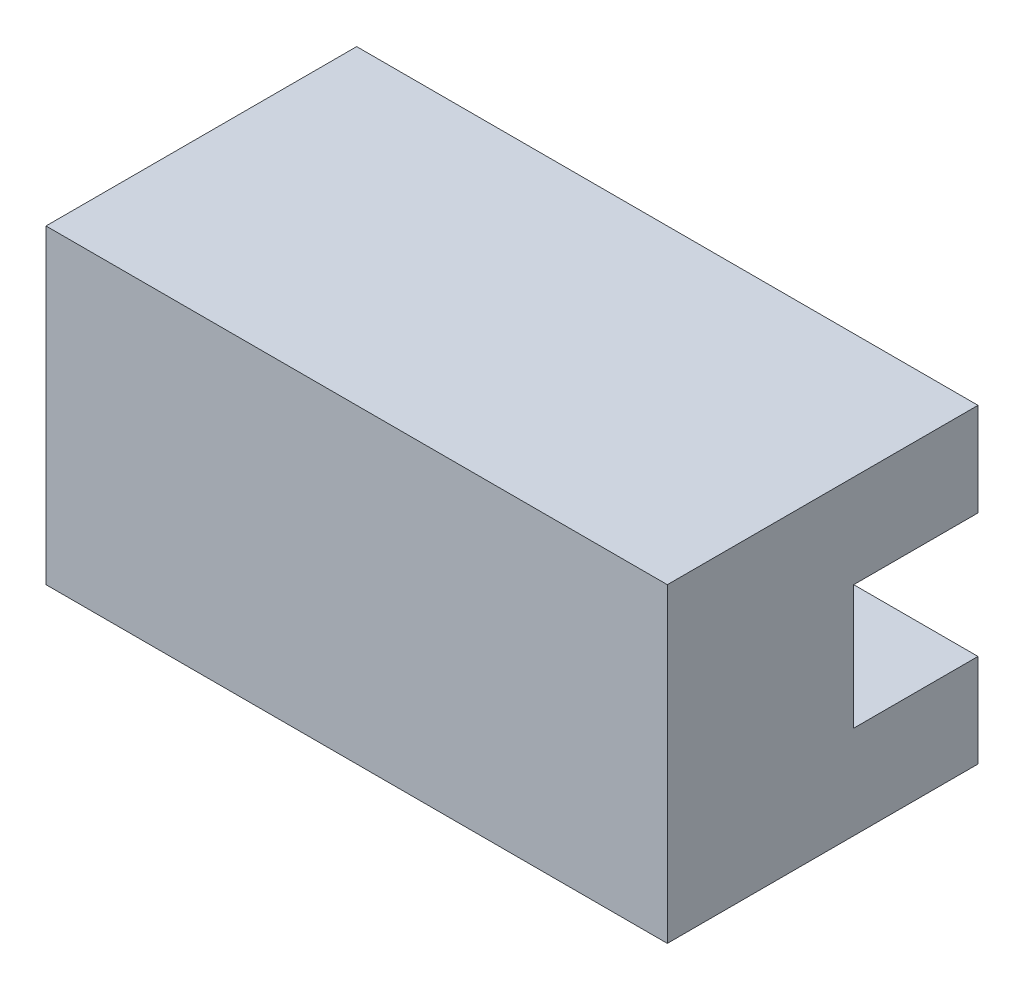
ISO-10303-21;
HEADER;
FILE_DESCRIPTION(('STEP AP214'),'2;1');
FILE_NAME('part.step','',(''),(''),'','','');
FILE_SCHEMA(('AUTOMOTIVE_DESIGN { 1 0 10303 214 1 1 1 1 }'));
ENDSEC;
DATA;
#1=APPLICATION_CONTEXT('core data for automotive mechanical design processes');
#2=APPLICATION_PROTOCOL_DEFINITION('international standard','automotive_design',2000,#1);
#3=PRODUCT_CONTEXT('',#1,'mechanical');
#4=PRODUCT('Part','Part','',(#3));
#5=PRODUCT_RELATED_PRODUCT_CATEGORY('part','',(#4));
#6=PRODUCT_DEFINITION_FORMATION('','',#4);
#7=PRODUCT_DEFINITION_CONTEXT('part definition',#1,'design');
#8=PRODUCT_DEFINITION('design','',#6,#7);
#9=PRODUCT_DEFINITION_SHAPE('','',#8);
#10=(LENGTH_UNIT() NAMED_UNIT(*) SI_UNIT(.MILLI.,.METRE.));
#11=(NAMED_UNIT(*) PLANE_ANGLE_UNIT() SI_UNIT($,.RADIAN.));
#12=(NAMED_UNIT(*) SI_UNIT($,.STERADIAN.) SOLID_ANGLE_UNIT());
#13=UNCERTAINTY_MEASURE_WITH_UNIT(LENGTH_MEASURE(1.E-05),#10,'distance_accuracy_value','');
#14=(GEOMETRIC_REPRESENTATION_CONTEXT(3) GLOBAL_UNCERTAINTY_ASSIGNED_CONTEXT((#13)) GLOBAL_UNIT_ASSIGNED_CONTEXT((#10,
#11,#12)) REPRESENTATION_CONTEXT('',''));
#15=CARTESIAN_POINT('',(0.,0.,0.));
#16=DIRECTION('',(0.,0.,1.));
#17=DIRECTION('',(1.,0.,0.));
#18=AXIS2_PLACEMENT_3D('',#15,#16,#17);
#19=CARTESIAN_POINT('',(-100.,100.,-50.));
#20=DIRECTION('',(0.,0.,1.));
#21=DIRECTION('',(1.,0.,0.));
#22=AXIS2_PLACEMENT_3D('',#19,#20,#21);
#23=PLANE('',#22);
#24=DIRECTION('',(0.,-1.,0.));
#25=VECTOR('',#24,1.);
#26=CARTESIAN_POINT('',(-100.,100.,-50.));
#27=LINE('',#26,#25);
#28=CARTESIAN_POINT('',(-100.,30.,-50.));
#29=VERTEX_POINT('',#28);
#30=CARTESIAN_POINT('',(-100.,0.,-50.));
#31=VERTEX_POINT('',#30);
#32=EDGE_CURVE('E130',#29,#31,#27,.T.);
#33=ORIENTED_EDGE('',*,*,#32,.F.);
#34=DIRECTION('',(1.,0.,0.));
#35=VECTOR('',#34,1.);
#36=CARTESIAN_POINT('',(-100.,30.,-50.));
#37=LINE('',#36,#35);
#38=CARTESIAN_POINT('',(100.,30.,-50.));
#39=VERTEX_POINT('',#38);
#40=EDGE_CURVE('E146',#29,#39,#37,.T.);
#41=ORIENTED_EDGE('',*,*,#40,.T.);
#42=DIRECTION('',(0.,-1.,0.));
#43=VECTOR('',#42,1.);
#44=CARTESIAN_POINT('',(100.,100.,-50.));
#45=LINE('',#44,#43);
#46=CARTESIAN_POINT('',(100.,0.,-50.));
#47=VERTEX_POINT('',#46);
#48=EDGE_CURVE('E45',#39,#47,#45,.T.);
#49=ORIENTED_EDGE('',*,*,#48,.T.);
#50=DIRECTION('',(-1.,0.,0.));
#51=VECTOR('',#50,1.);
#52=CARTESIAN_POINT('',(-100.,0.,-50.));
#53=LINE('',#52,#51);
#54=EDGE_CURVE('E140',#47,#31,#53,.T.);
#55=ORIENTED_EDGE('',*,*,#54,.T.);
#56=EDGE_LOOP('',(#33,#41,#49,#55));
#57=FACE_BOUND('',#56,.T.);
#58=ADVANCED_FACE('F37',(#57),#23,.F.);
#59=CARTESIAN_POINT('',(100.,100.,50.));
#60=DIRECTION('',(-1.,0.,0.));
#61=DIRECTION('',(0.,0.,1.));
#62=AXIS2_PLACEMENT_3D('',#59,#60,#61);
#63=PLANE('',#62);
#64=ORIENTED_EDGE('',*,*,#48,.F.);
#65=DIRECTION('',(0.,0.,-1.));
#66=VECTOR('',#65,1.);
#67=CARTESIAN_POINT('',(100.,30.,-50.));
#68=LINE('',#67,#66);
#69=CARTESIAN_POINT('',(100.,30.,-10.));
#70=VERTEX_POINT('',#69);
#71=EDGE_CURVE('E119',#70,#39,#68,.T.);
#72=ORIENTED_EDGE('',*,*,#71,.F.);
#73=DIRECTION('',(0.,-1.,0.));
#74=VECTOR('',#73,1.);
#75=CARTESIAN_POINT('',(100.,70.,-10.));
#76=LINE('',#75,#74);
#77=CARTESIAN_POINT('',(100.,70.,-10.));
#78=VERTEX_POINT('',#77);
#79=EDGE_CURVE('E157',#78,#70,#76,.T.);
#80=ORIENTED_EDGE('',*,*,#79,.F.);
#81=DIRECTION('',(0.,0.,1.));
#82=VECTOR('',#81,1.);
#83=CARTESIAN_POINT('',(100.,70.,-50.));
#84=LINE('',#83,#82);
#85=CARTESIAN_POINT('',(100.,70.,-50.));
#86=VERTEX_POINT('',#85);
#87=EDGE_CURVE('E160',#86,#78,#84,.T.);
#88=ORIENTED_EDGE('',*,*,#87,.F.);
#89=CARTESIAN_POINT('',(100.,100.,-50.));
#90=VERTEX_POINT('',#89);
#91=EDGE_CURVE('E11',#90,#86,#45,.T.);
#92=ORIENTED_EDGE('',*,*,#91,.F.);
#93=DIRECTION('',(0.,0.,-1.));
#94=VECTOR('',#93,1.);
#95=CARTESIAN_POINT('',(100.,100.,50.));
#96=LINE('',#95,#94);
#97=CARTESIAN_POINT('',(100.,100.,50.));
#98=VERTEX_POINT('',#97);
#99=EDGE_CURVE('E137',#98,#90,#96,.T.);
#100=ORIENTED_EDGE('',*,*,#99,.F.);
#101=DIRECTION('',(0.,-1.,0.));
#102=VECTOR('',#101,1.);
#103=CARTESIAN_POINT('',(100.,100.,50.));
#104=LINE('',#103,#102);
#105=CARTESIAN_POINT('',(100.,0.,50.));
#106=VERTEX_POINT('',#105);
#107=EDGE_CURVE('E134',#98,#106,#104,.T.);
#108=ORIENTED_EDGE('',*,*,#107,.T.);
#109=DIRECTION('',(0.,0.,-1.));
#110=VECTOR('',#109,1.);
#111=CARTESIAN_POINT('',(100.,0.,50.));
#112=LINE('',#111,#110);
#113=EDGE_CURVE('E143',#106,#47,#112,.T.);
#114=ORIENTED_EDGE('',*,*,#113,.T.);
#115=EDGE_LOOP('',(#64,#72,#80,#88,#92,#100,#108,#114));
#116=FACE_BOUND('',#115,.T.);
#117=ADVANCED_FACE('F39',(#116),#63,.F.);
#118=ORIENTED_EDGE('',*,*,#91,.T.);
#119=DIRECTION('',(1.,0.,0.));
#120=VECTOR('',#119,1.);
#121=CARTESIAN_POINT('',(-100.,70.,-50.));
#122=LINE('',#121,#120);
#123=CARTESIAN_POINT('',(-100.,70.,-50.));
#124=VERTEX_POINT('',#123);
#125=EDGE_CURVE('E114',#124,#86,#122,.T.);
#126=ORIENTED_EDGE('',*,*,#125,.F.);
#127=CARTESIAN_POINT('',(-100.,100.,-50.));
#128=VERTEX_POINT('',#127);
#129=EDGE_CURVE('E122',#128,#124,#27,.T.);
#130=ORIENTED_EDGE('',*,*,#129,.F.);
#131=DIRECTION('',(-1.,0.,0.));
#132=VECTOR('',#131,1.);
#133=CARTESIAN_POINT('',(-100.,100.,-50.));
#134=LINE('',#133,#132);
#135=EDGE_CURVE('E89',#90,#128,#134,.T.);
#136=ORIENTED_EDGE('',*,*,#135,.F.);
#137=EDGE_LOOP('',(#118,#126,#130,#136));
#138=FACE_BOUND('',#137,.T.);
#139=ADVANCED_FACE('F121',(#138),#23,.F.);
#140=CARTESIAN_POINT('',(-100.,100.,50.));
#141=DIRECTION('',(1.,0.,0.));
#142=DIRECTION('',(0.,0.,-1.));
#143=AXIS2_PLACEMENT_3D('',#140,#141,#142);
#144=PLANE('',#143);
#145=DIRECTION('',(0.,-1.,0.));
#146=VECTOR('',#145,1.);
#147=CARTESIAN_POINT('',(-100.,70.,-10.));
#148=LINE('',#147,#146);
#149=CARTESIAN_POINT('',(-100.,70.,-10.));
#150=VERTEX_POINT('',#149);
#151=CARTESIAN_POINT('',(-100.,30.,-10.));
#152=VERTEX_POINT('',#151);
#153=EDGE_CURVE('E52',#150,#152,#148,.T.);
#154=ORIENTED_EDGE('',*,*,#153,.T.);
#155=DIRECTION('',(0.,0.,-1.));
#156=VECTOR('',#155,1.);
#157=CARTESIAN_POINT('',(-100.,30.,-50.));
#158=LINE('',#157,#156);
#159=EDGE_CURVE('E125',#152,#29,#158,.T.);
#160=ORIENTED_EDGE('',*,*,#159,.T.);
#161=ORIENTED_EDGE('',*,*,#32,.T.);
#162=DIRECTION('',(0.,0.,1.));
#163=VECTOR('',#162,1.);
#164=CARTESIAN_POINT('',(-100.,0.,50.));
#165=LINE('',#164,#163);
#166=CARTESIAN_POINT('',(-100.,0.,50.));
#167=VERTEX_POINT('',#166);
#168=EDGE_CURVE('E138',#31,#167,#165,.T.);
#169=ORIENTED_EDGE('',*,*,#168,.T.);
#170=DIRECTION('',(0.,-1.,0.));
#171=VECTOR('',#170,1.);
#172=CARTESIAN_POINT('',(-100.,100.,50.));
#173=LINE('',#172,#171);
#174=CARTESIAN_POINT('',(-100.,100.,50.));
#175=VERTEX_POINT('',#174);
#176=EDGE_CURVE('E131',#175,#167,#173,.T.);
#177=ORIENTED_EDGE('',*,*,#176,.F.);
#178=DIRECTION('',(0.,0.,1.));
#179=VECTOR('',#178,1.);
#180=CARTESIAN_POINT('',(-100.,100.,50.));
#181=LINE('',#180,#179);
#182=EDGE_CURVE('E129',#128,#175,#181,.T.);
#183=ORIENTED_EDGE('',*,*,#182,.F.);
#184=ORIENTED_EDGE('',*,*,#129,.T.);
#185=DIRECTION('',(0.,0.,1.));
#186=VECTOR('',#185,1.);
#187=CARTESIAN_POINT('',(-100.,70.,-50.));
#188=LINE('',#187,#186);
#189=EDGE_CURVE('E110',#124,#150,#188,.T.);
#190=ORIENTED_EDGE('',*,*,#189,.T.);
#191=EDGE_LOOP('',(#154,#160,#161,#169,#177,#183,#184,#190));
#192=FACE_BOUND('',#191,.T.);
#193=ADVANCED_FACE('F127',(#192),#144,.F.);
#194=CARTESIAN_POINT('',(-100.,100.,50.));
#195=DIRECTION('',(0.,0.,-1.));
#196=DIRECTION('',(-1.,0.,0.));
#197=AXIS2_PLACEMENT_3D('',#194,#195,#196);
#198=PLANE('',#197);
#199=DIRECTION('',(1.,0.,0.));
#200=VECTOR('',#199,1.);
#201=CARTESIAN_POINT('',(-100.,0.,50.));
#202=LINE('',#201,#200);
#203=EDGE_CURVE('E82',#167,#106,#202,.T.);
#204=ORIENTED_EDGE('',*,*,#203,.T.);
#205=ORIENTED_EDGE('',*,*,#107,.F.);
#206=DIRECTION('',(1.,0.,0.));
#207=VECTOR('',#206,1.);
#208=CARTESIAN_POINT('',(-100.,100.,50.));
#209=LINE('',#208,#207);
#210=EDGE_CURVE('E61',#175,#98,#209,.T.);
#211=ORIENTED_EDGE('',*,*,#210,.F.);
#212=ORIENTED_EDGE('',*,*,#176,.T.);
#213=EDGE_LOOP('',(#204,#205,#211,#212));
#214=FACE_BOUND('',#213,.T.);
#215=ADVANCED_FACE('F174',(#214),#198,.F.);
#216=CARTESIAN_POINT('',(0.,100.,0.));
#217=DIRECTION('',(0.,-1.,0.));
#218=DIRECTION('',(0.,0.,-1.));
#219=AXIS2_PLACEMENT_3D('',#216,#217,#218);
#220=PLANE('',#219);
#221=ORIENTED_EDGE('',*,*,#99,.T.);
#222=ORIENTED_EDGE('',*,*,#135,.T.);
#223=ORIENTED_EDGE('',*,*,#182,.T.);
#224=ORIENTED_EDGE('',*,*,#210,.T.);
#225=EDGE_LOOP('',(#221,#222,#223,#224));
#226=FACE_BOUND('',#225,.T.);
#227=ADVANCED_FACE('F177',(#226),#220,.F.);
#228=CARTESIAN_POINT('',(0.,0.,0.));
#229=DIRECTION('',(0.,-1.,0.));
#230=DIRECTION('',(0.,0.,-1.));
#231=AXIS2_PLACEMENT_3D('',#228,#229,#230);
#232=PLANE('',#231);
#233=ORIENTED_EDGE('',*,*,#113,.F.);
#234=ORIENTED_EDGE('',*,*,#203,.F.);
#235=ORIENTED_EDGE('',*,*,#168,.F.);
#236=ORIENTED_EDGE('',*,*,#54,.F.);
#237=EDGE_LOOP('',(#233,#234,#235,#236));
#238=FACE_BOUND('',#237,.T.);
#239=ADVANCED_FACE('F173',(#238),#232,.T.);
#240=CARTESIAN_POINT('',(-100.,30.,-50.));
#241=DIRECTION('',(0.,-1.,0.));
#242=DIRECTION('',(0.,0.,-1.));
#243=AXIS2_PLACEMENT_3D('',#240,#241,#242);
#244=PLANE('',#243);
#245=ORIENTED_EDGE('',*,*,#71,.T.);
#246=ORIENTED_EDGE('',*,*,#40,.F.);
#247=ORIENTED_EDGE('',*,*,#159,.F.);
#248=DIRECTION('',(1.,0.,0.));
#249=VECTOR('',#248,1.);
#250=CARTESIAN_POINT('',(-100.,30.,-10.));
#251=LINE('',#250,#249);
#252=EDGE_CURVE('E152',#152,#70,#251,.T.);
#253=ORIENTED_EDGE('',*,*,#252,.T.);
#254=EDGE_LOOP('',(#245,#246,#247,#253));
#255=FACE_BOUND('',#254,.T.);
#256=ADVANCED_FACE('F184',(#255),#244,.F.);
#257=CARTESIAN_POINT('',(-100.,70.,-10.));
#258=DIRECTION('',(0.,0.,1.));
#259=DIRECTION('',(0.,-1.,0.));
#260=AXIS2_PLACEMENT_3D('',#257,#258,#259);
#261=PLANE('',#260);
#262=ORIENTED_EDGE('',*,*,#79,.T.);
#263=ORIENTED_EDGE('',*,*,#252,.F.);
#264=ORIENTED_EDGE('',*,*,#153,.F.);
#265=DIRECTION('',(1.,0.,0.));
#266=VECTOR('',#265,1.);
#267=CARTESIAN_POINT('',(-100.,70.,-10.));
#268=LINE('',#267,#266);
#269=EDGE_CURVE('E116',#150,#78,#268,.T.);
#270=ORIENTED_EDGE('',*,*,#269,.T.);
#271=EDGE_LOOP('',(#262,#263,#264,#270));
#272=FACE_BOUND('',#271,.T.);
#273=ADVANCED_FACE('F253',(#272),#261,.F.);
#274=CARTESIAN_POINT('',(-100.,70.,-50.));
#275=DIRECTION('',(0.,1.,0.));
#276=DIRECTION('',(0.,0.,1.));
#277=AXIS2_PLACEMENT_3D('',#274,#275,#276);
#278=PLANE('',#277);
#279=ORIENTED_EDGE('',*,*,#87,.T.);
#280=ORIENTED_EDGE('',*,*,#269,.F.);
#281=ORIENTED_EDGE('',*,*,#189,.F.);
#282=ORIENTED_EDGE('',*,*,#125,.T.);
#283=EDGE_LOOP('',(#279,#280,#281,#282));
#284=FACE_BOUND('',#283,.T.);
#285=ADVANCED_FACE('F113',(#284),#278,.F.);
#286=CLOSED_SHELL('',(#58,#117,#139,#193,#215,#227,#239,#256,#273,#285));
#287=MANIFOLD_SOLID_BREP('B2',#286);
#288=ADVANCED_BREP_SHAPE_REPRESENTATION('',(#18,#287),#14);
#289=SHAPE_DEFINITION_REPRESENTATION(#9,#288);
ENDSEC;
END-ISO-10303-21;
